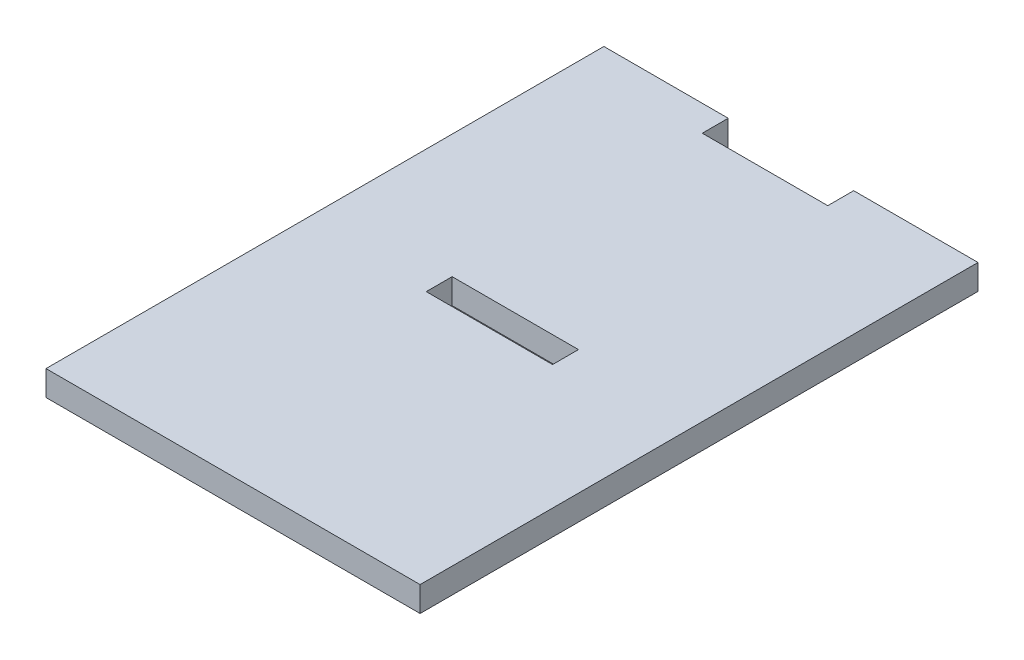
ISO-10303-21;
HEADER;
FILE_DESCRIPTION(('STEP AP214'),'2;1');
FILE_NAME('part.step','',(''),(''),'','','');
FILE_SCHEMA(('AUTOMOTIVE_DESIGN { 1 0 10303 214 1 1 1 1 }'));
ENDSEC;
DATA;
#1=APPLICATION_CONTEXT('core data for automotive mechanical design processes');
#2=APPLICATION_PROTOCOL_DEFINITION('international standard','automotive_design',2000,#1);
#3=PRODUCT_CONTEXT('',#1,'mechanical');
#4=PRODUCT('Part','Part','',(#3));
#5=PRODUCT_RELATED_PRODUCT_CATEGORY('part','',(#4));
#6=PRODUCT_DEFINITION_FORMATION('','',#4);
#7=PRODUCT_DEFINITION_CONTEXT('part definition',#1,'design');
#8=PRODUCT_DEFINITION('design','',#6,#7);
#9=PRODUCT_DEFINITION_SHAPE('','',#8);
#10=(LENGTH_UNIT() NAMED_UNIT(*) SI_UNIT(.MILLI.,.METRE.));
#11=(NAMED_UNIT(*) PLANE_ANGLE_UNIT() SI_UNIT($,.RADIAN.));
#12=(NAMED_UNIT(*) SI_UNIT($,.STERADIAN.) SOLID_ANGLE_UNIT());
#13=UNCERTAINTY_MEASURE_WITH_UNIT(LENGTH_MEASURE(1.E-05),#10,'distance_accuracy_value','');
#14=(GEOMETRIC_REPRESENTATION_CONTEXT(3) GLOBAL_UNCERTAINTY_ASSIGNED_CONTEXT((#13)) GLOBAL_UNIT_ASSIGNED_CONTEXT((#10,
#11,#12)) REPRESENTATION_CONTEXT('',''));
#15=CARTESIAN_POINT('',(0.,0.,0.));
#16=DIRECTION('',(0.,0.,1.));
#17=DIRECTION('',(1.,0.,0.));
#18=AXIS2_PLACEMENT_3D('',#15,#16,#17);
#19=CARTESIAN_POINT('',(0.,3.,0.));
#20=DIRECTION('',(0.,-1.,0.));
#21=DIRECTION('',(0.,0.,-1.));
#22=AXIS2_PLACEMENT_3D('',#19,#20,#21);
#23=PLANE('',#22);
#24=DIRECTION('',(0.,0.,1.));
#25=VECTOR('',#24,1.);
#26=CARTESIAN_POINT('',(0.,3.,0.));
#27=LINE('',#26,#25);
#28=CARTESIAN_POINT('',(0.,3.,-66.69));
#29=VERTEX_POINT('',#28);
#30=CARTESIAN_POINT('',(0.,3.,0.));
#31=VERTEX_POINT('',#30);
#32=EDGE_CURVE('E164',#29,#31,#27,.T.);
#33=ORIENTED_EDGE('',*,*,#32,.T.);
#34=DIRECTION('',(1.,0.,0.));
#35=VECTOR('',#34,1.);
#36=CARTESIAN_POINT('',(0.,3.,0.));
#37=LINE('',#36,#35);
#38=CARTESIAN_POINT('',(44.72,3.,0.));
#39=VERTEX_POINT('',#38);
#40=EDGE_CURVE('E167',#31,#39,#37,.T.);
#41=ORIENTED_EDGE('',*,*,#40,.T.);
#42=DIRECTION('',(0.,0.,-1.));
#43=VECTOR('',#42,1.);
#44=CARTESIAN_POINT('',(44.72,3.,0.));
#45=LINE('',#44,#43);
#46=CARTESIAN_POINT('',(44.72,3.,-66.69));
#47=VERTEX_POINT('',#46);
#48=EDGE_CURVE('E170',#39,#47,#45,.T.);
#49=ORIENTED_EDGE('',*,*,#48,.T.);
#50=DIRECTION('',(-1.,0.,0.));
#51=VECTOR('',#50,1.);
#52=CARTESIAN_POINT('',(29.86,3.,-66.69));
#53=LINE('',#52,#51);
#54=CARTESIAN_POINT('',(29.86,3.,-66.69));
#55=VERTEX_POINT('',#54);
#56=EDGE_CURVE('E172',#47,#55,#53,.T.);
#57=ORIENTED_EDGE('',*,*,#56,.T.);
#58=DIRECTION('',(0.,0.,1.));
#59=VECTOR('',#58,1.);
#60=CARTESIAN_POINT('',(29.86,3.,-66.69));
#61=LINE('',#60,#59);
#62=CARTESIAN_POINT('',(29.86,3.,-63.59));
#63=VERTEX_POINT('',#62);
#64=EDGE_CURVE('E174',#55,#63,#61,.T.);
#65=ORIENTED_EDGE('',*,*,#64,.T.);
#66=DIRECTION('',(-1.,0.,0.));
#67=VECTOR('',#66,1.);
#68=CARTESIAN_POINT('',(14.86,3.,-63.59));
#69=LINE('',#68,#67);
#70=CARTESIAN_POINT('',(14.86,3.,-63.59));
#71=VERTEX_POINT('',#70);
#72=EDGE_CURVE('E176',#63,#71,#69,.T.);
#73=ORIENTED_EDGE('',*,*,#72,.T.);
#74=DIRECTION('',(0.,0.,-1.));
#75=VECTOR('',#74,1.);
#76=CARTESIAN_POINT('',(14.86,3.,-66.69));
#77=LINE('',#76,#75);
#78=CARTESIAN_POINT('',(14.86,3.,-66.69));
#79=VERTEX_POINT('',#78);
#80=EDGE_CURVE('E178',#71,#79,#77,.T.);
#81=ORIENTED_EDGE('',*,*,#80,.T.);
#82=DIRECTION('',(-1.,0.,0.));
#83=VECTOR('',#82,1.);
#84=CARTESIAN_POINT('',(0.,3.,-66.69));
#85=LINE('',#84,#83);
#86=EDGE_CURVE('E180',#79,#29,#85,.T.);
#87=ORIENTED_EDGE('',*,*,#86,.T.);
#88=EDGE_LOOP('',(#33,#41,#49,#57,#65,#73,#81,#87));
#89=FACE_BOUND('',#88,.T.);
#90=DIRECTION('',(0.,0.,1.));
#91=VECTOR('',#90,1.);
#92=CARTESIAN_POINT('',(14.76,3.,-33.79));
#93=LINE('',#92,#91);
#94=CARTESIAN_POINT('',(14.76,3.,-33.79));
#95=VERTEX_POINT('',#94);
#96=CARTESIAN_POINT('',(14.76,3.,-30.69));
#97=VERTEX_POINT('',#96);
#98=EDGE_CURVE('E128',#95,#97,#93,.T.);
#99=ORIENTED_EDGE('',*,*,#98,.F.);
#100=DIRECTION('',(-1.,0.,0.));
#101=VECTOR('',#100,1.);
#102=CARTESIAN_POINT('',(14.76,3.,-33.79));
#103=LINE('',#102,#101);
#104=CARTESIAN_POINT('',(29.86,3.,-33.79));
#105=VERTEX_POINT('',#104);
#106=EDGE_CURVE('E150',#105,#95,#103,.T.);
#107=ORIENTED_EDGE('',*,*,#106,.F.);
#108=DIRECTION('',(0.,0.,-1.));
#109=VECTOR('',#108,1.);
#110=CARTESIAN_POINT('',(29.86,3.,-33.79));
#111=LINE('',#110,#109);
#112=CARTESIAN_POINT('',(29.86,3.,-30.69));
#113=VERTEX_POINT('',#112);
#114=EDGE_CURVE('E148',#113,#105,#111,.T.);
#115=ORIENTED_EDGE('',*,*,#114,.F.);
#116=DIRECTION('',(1.,0.,0.));
#117=VECTOR('',#116,1.);
#118=CARTESIAN_POINT('',(14.76,3.,-30.69));
#119=LINE('',#118,#117);
#120=EDGE_CURVE('E136',#97,#113,#119,.T.);
#121=ORIENTED_EDGE('',*,*,#120,.F.);
#122=EDGE_LOOP('',(#99,#107,#115,#121));
#123=FACE_BOUND('',#122,.T.);
#124=ADVANCED_FACE('F39',(#89,#123),#23,.F.);
#125=CARTESIAN_POINT('',(0.,0.,0.));
#126=DIRECTION('',(0.,-1.,0.));
#127=DIRECTION('',(0.,0.,-1.));
#128=AXIS2_PLACEMENT_3D('',#125,#126,#127);
#129=PLANE('',#128);
#130=DIRECTION('',(0.,0.,1.));
#131=VECTOR('',#130,1.);
#132=CARTESIAN_POINT('',(0.,0.,0.));
#133=LINE('',#132,#131);
#134=CARTESIAN_POINT('',(0.,0.,-66.69));
#135=VERTEX_POINT('',#134);
#136=CARTESIAN_POINT('',(0.,0.,0.));
#137=VERTEX_POINT('',#136);
#138=EDGE_CURVE('E144',#135,#137,#133,.T.);
#139=ORIENTED_EDGE('',*,*,#138,.F.);
#140=DIRECTION('',(-1.,0.,0.));
#141=VECTOR('',#140,1.);
#142=CARTESIAN_POINT('',(0.,0.,-66.69));
#143=LINE('',#142,#141);
#144=CARTESIAN_POINT('',(14.86,0.,-66.69));
#145=VERTEX_POINT('',#144);
#146=EDGE_CURVE('E168',#145,#135,#143,.T.);
#147=ORIENTED_EDGE('',*,*,#146,.F.);
#148=DIRECTION('',(0.,0.,-1.));
#149=VECTOR('',#148,1.);
#150=CARTESIAN_POINT('',(14.86,0.,-66.69));
#151=LINE('',#150,#149);
#152=CARTESIAN_POINT('',(14.86,0.,-63.59));
#153=VERTEX_POINT('',#152);
#154=EDGE_CURVE('E195',#153,#145,#151,.T.);
#155=ORIENTED_EDGE('',*,*,#154,.F.);
#156=DIRECTION('',(-1.,0.,0.));
#157=VECTOR('',#156,1.);
#158=CARTESIAN_POINT('',(14.86,0.,-63.59));
#159=LINE('',#158,#157);
#160=CARTESIAN_POINT('',(29.86,0.,-63.59));
#161=VERTEX_POINT('',#160);
#162=EDGE_CURVE('E193',#161,#153,#159,.T.);
#163=ORIENTED_EDGE('',*,*,#162,.F.);
#164=DIRECTION('',(0.,0.,1.));
#165=VECTOR('',#164,1.);
#166=CARTESIAN_POINT('',(29.86,0.,-66.69));
#167=LINE('',#166,#165);
#168=CARTESIAN_POINT('',(29.86,0.,-66.69));
#169=VERTEX_POINT('',#168);
#170=EDGE_CURVE('E191',#169,#161,#167,.T.);
#171=ORIENTED_EDGE('',*,*,#170,.F.);
#172=DIRECTION('',(-1.,0.,0.));
#173=VECTOR('',#172,1.);
#174=CARTESIAN_POINT('',(29.86,0.,-66.69));
#175=LINE('',#174,#173);
#176=CARTESIAN_POINT('',(44.72,0.,-66.69));
#177=VERTEX_POINT('',#176);
#178=EDGE_CURVE('E189',#177,#169,#175,.T.);
#179=ORIENTED_EDGE('',*,*,#178,.F.);
#180=DIRECTION('',(0.,0.,-1.));
#181=VECTOR('',#180,1.);
#182=CARTESIAN_POINT('',(44.72,0.,0.));
#183=LINE('',#182,#181);
#184=CARTESIAN_POINT('',(44.72,0.,0.));
#185=VERTEX_POINT('',#184);
#186=EDGE_CURVE('E187',#185,#177,#183,.T.);
#187=ORIENTED_EDGE('',*,*,#186,.F.);
#188=DIRECTION('',(1.,0.,0.));
#189=VECTOR('',#188,1.);
#190=CARTESIAN_POINT('',(0.,0.,0.));
#191=LINE('',#190,#189);
#192=EDGE_CURVE('E185',#137,#185,#191,.T.);
#193=ORIENTED_EDGE('',*,*,#192,.F.);
#194=EDGE_LOOP('',(#139,#147,#155,#163,#171,#179,#187,#193));
#195=FACE_BOUND('',#194,.T.);
#196=DIRECTION('',(-1.,0.,0.));
#197=VECTOR('',#196,1.);
#198=CARTESIAN_POINT('',(14.76,0.,-33.79));
#199=LINE('',#198,#197);
#200=CARTESIAN_POINT('',(29.86,0.,-33.79));
#201=VERTEX_POINT('',#200);
#202=CARTESIAN_POINT('',(14.76,0.,-33.79));
#203=VERTEX_POINT('',#202);
#204=EDGE_CURVE('E137',#201,#203,#199,.T.);
#205=ORIENTED_EDGE('',*,*,#204,.T.);
#206=DIRECTION('',(0.,0.,1.));
#207=VECTOR('',#206,1.);
#208=CARTESIAN_POINT('',(14.76,0.,-33.79));
#209=LINE('',#208,#207);
#210=CARTESIAN_POINT('',(14.76,0.,-30.69));
#211=VERTEX_POINT('',#210);
#212=EDGE_CURVE('E62',#203,#211,#209,.T.);
#213=ORIENTED_EDGE('',*,*,#212,.T.);
#214=DIRECTION('',(1.,0.,0.));
#215=VECTOR('',#214,1.);
#216=CARTESIAN_POINT('',(14.76,0.,-30.69));
#217=LINE('',#216,#215);
#218=CARTESIAN_POINT('',(29.86,0.,-30.69));
#219=VERTEX_POINT('',#218);
#220=EDGE_CURVE('E143',#211,#219,#217,.T.);
#221=ORIENTED_EDGE('',*,*,#220,.T.);
#222=DIRECTION('',(0.,0.,-1.));
#223=VECTOR('',#222,1.);
#224=CARTESIAN_POINT('',(29.86,0.,-33.79));
#225=LINE('',#224,#223);
#226=EDGE_CURVE('E156',#219,#201,#225,.T.);
#227=ORIENTED_EDGE('',*,*,#226,.T.);
#228=EDGE_LOOP('',(#205,#213,#221,#227));
#229=FACE_BOUND('',#228,.T.);
#230=ADVANCED_FACE('F225',(#195,#229),#129,.T.);
#231=CARTESIAN_POINT('',(0.,3.,0.));
#232=DIRECTION('',(1.,0.,0.));
#233=DIRECTION('',(0.,0.,-1.));
#234=AXIS2_PLACEMENT_3D('',#231,#232,#233);
#235=PLANE('',#234);
#236=ORIENTED_EDGE('',*,*,#138,.T.);
#237=DIRECTION('',(0.,-1.,0.));
#238=VECTOR('',#237,1.);
#239=CARTESIAN_POINT('',(0.,3.,0.));
#240=LINE('',#239,#238);
#241=EDGE_CURVE('E11',#31,#137,#240,.T.);
#242=ORIENTED_EDGE('',*,*,#241,.F.);
#243=ORIENTED_EDGE('',*,*,#32,.F.);
#244=DIRECTION('',(0.,-1.,0.));
#245=VECTOR('',#244,1.);
#246=CARTESIAN_POINT('',(0.,3.,-66.69));
#247=LINE('',#246,#245);
#248=EDGE_CURVE('E182',#29,#135,#247,.T.);
#249=ORIENTED_EDGE('',*,*,#248,.T.);
#250=EDGE_LOOP('',(#236,#242,#243,#249));
#251=FACE_BOUND('',#250,.T.);
#252=ADVANCED_FACE('F41',(#251),#235,.F.);
#253=CARTESIAN_POINT('',(0.,3.,0.));
#254=DIRECTION('',(0.,0.,-1.));
#255=DIRECTION('',(-1.,0.,0.));
#256=AXIS2_PLACEMENT_3D('',#253,#254,#255);
#257=PLANE('',#256);
#258=ORIENTED_EDGE('',*,*,#192,.T.);
#259=DIRECTION('',(0.,-1.,0.));
#260=VECTOR('',#259,1.);
#261=CARTESIAN_POINT('',(44.72,3.,0.));
#262=LINE('',#261,#260);
#263=EDGE_CURVE('E47',#39,#185,#262,.T.);
#264=ORIENTED_EDGE('',*,*,#263,.F.);
#265=ORIENTED_EDGE('',*,*,#40,.F.);
#266=ORIENTED_EDGE('',*,*,#241,.T.);
#267=EDGE_LOOP('',(#258,#264,#265,#266));
#268=FACE_BOUND('',#267,.T.);
#269=ADVANCED_FACE('F242',(#268),#257,.F.);
#270=CARTESIAN_POINT('',(44.72,3.,0.));
#271=DIRECTION('',(-1.,0.,0.));
#272=DIRECTION('',(0.,0.,1.));
#273=AXIS2_PLACEMENT_3D('',#270,#271,#272);
#274=PLANE('',#273);
#275=ORIENTED_EDGE('',*,*,#186,.T.);
#276=DIRECTION('',(0.,-1.,0.));
#277=VECTOR('',#276,1.);
#278=CARTESIAN_POINT('',(44.72,3.,-66.69));
#279=LINE('',#278,#277);
#280=EDGE_CURVE('E212',#47,#177,#279,.T.);
#281=ORIENTED_EDGE('',*,*,#280,.F.);
#282=ORIENTED_EDGE('',*,*,#48,.F.);
#283=ORIENTED_EDGE('',*,*,#263,.T.);
#284=EDGE_LOOP('',(#275,#281,#282,#283));
#285=FACE_BOUND('',#284,.T.);
#286=ADVANCED_FACE('F219',(#285),#274,.F.);
#287=CARTESIAN_POINT('',(29.86,3.,-66.69));
#288=DIRECTION('',(0.,0.,1.));
#289=DIRECTION('',(1.,0.,0.));
#290=AXIS2_PLACEMENT_3D('',#287,#288,#289);
#291=PLANE('',#290);
#292=ORIENTED_EDGE('',*,*,#178,.T.);
#293=DIRECTION('',(0.,-1.,0.));
#294=VECTOR('',#293,1.);
#295=CARTESIAN_POINT('',(29.86,3.,-66.69));
#296=LINE('',#295,#294);
#297=EDGE_CURVE('E209',#55,#169,#296,.T.);
#298=ORIENTED_EDGE('',*,*,#297,.F.);
#299=ORIENTED_EDGE('',*,*,#56,.F.);
#300=ORIENTED_EDGE('',*,*,#280,.T.);
#301=EDGE_LOOP('',(#292,#298,#299,#300));
#302=FACE_BOUND('',#301,.T.);
#303=ADVANCED_FACE('F231',(#302),#291,.F.);
#304=CARTESIAN_POINT('',(29.86,3.,-66.69));
#305=DIRECTION('',(1.,0.,0.));
#306=DIRECTION('',(0.,0.,-1.));
#307=AXIS2_PLACEMENT_3D('',#304,#305,#306);
#308=PLANE('',#307);
#309=ORIENTED_EDGE('',*,*,#170,.T.);
#310=DIRECTION('',(0.,-1.,0.));
#311=VECTOR('',#310,1.);
#312=CARTESIAN_POINT('',(29.86,3.,-63.59));
#313=LINE('',#312,#311);
#314=EDGE_CURVE('E206',#63,#161,#313,.T.);
#315=ORIENTED_EDGE('',*,*,#314,.F.);
#316=ORIENTED_EDGE('',*,*,#64,.F.);
#317=ORIENTED_EDGE('',*,*,#297,.T.);
#318=EDGE_LOOP('',(#309,#315,#316,#317));
#319=FACE_BOUND('',#318,.T.);
#320=ADVANCED_FACE('F235',(#319),#308,.F.);
#321=CARTESIAN_POINT('',(14.86,3.,-63.59));
#322=DIRECTION('',(0.,0.,1.));
#323=DIRECTION('',(1.,0.,0.));
#324=AXIS2_PLACEMENT_3D('',#321,#322,#323);
#325=PLANE('',#324);
#326=ORIENTED_EDGE('',*,*,#162,.T.);
#327=DIRECTION('',(0.,-1.,0.));
#328=VECTOR('',#327,1.);
#329=CARTESIAN_POINT('',(14.86,3.,-63.59));
#330=LINE('',#329,#328);
#331=EDGE_CURVE('E203',#71,#153,#330,.T.);
#332=ORIENTED_EDGE('',*,*,#331,.F.);
#333=ORIENTED_EDGE('',*,*,#72,.F.);
#334=ORIENTED_EDGE('',*,*,#314,.T.);
#335=EDGE_LOOP('',(#326,#332,#333,#334));
#336=FACE_BOUND('',#335,.T.);
#337=ADVANCED_FACE('F255',(#336),#325,.F.);
#338=CARTESIAN_POINT('',(14.86,3.,-66.69));
#339=DIRECTION('',(-1.,0.,0.));
#340=DIRECTION('',(0.,0.,1.));
#341=AXIS2_PLACEMENT_3D('',#338,#339,#340);
#342=PLANE('',#341);
#343=ORIENTED_EDGE('',*,*,#154,.T.);
#344=DIRECTION('',(0.,-1.,0.));
#345=VECTOR('',#344,1.);
#346=CARTESIAN_POINT('',(14.86,3.,-66.69));
#347=LINE('',#346,#345);
#348=EDGE_CURVE('E200',#79,#145,#347,.T.);
#349=ORIENTED_EDGE('',*,*,#348,.F.);
#350=ORIENTED_EDGE('',*,*,#80,.F.);
#351=ORIENTED_EDGE('',*,*,#331,.T.);
#352=EDGE_LOOP('',(#343,#349,#350,#351));
#353=FACE_BOUND('',#352,.T.);
#354=ADVANCED_FACE('F253',(#353),#342,.F.);
#355=CARTESIAN_POINT('',(0.,3.,-66.69));
#356=DIRECTION('',(0.,0.,1.));
#357=DIRECTION('',(1.,0.,0.));
#358=AXIS2_PLACEMENT_3D('',#355,#356,#357);
#359=PLANE('',#358);
#360=ORIENTED_EDGE('',*,*,#146,.T.);
#361=ORIENTED_EDGE('',*,*,#248,.F.);
#362=ORIENTED_EDGE('',*,*,#86,.F.);
#363=ORIENTED_EDGE('',*,*,#348,.T.);
#364=EDGE_LOOP('',(#360,#361,#362,#363));
#365=FACE_BOUND('',#364,.T.);
#366=ADVANCED_FACE('F248',(#365),#359,.F.);
#367=CARTESIAN_POINT('',(14.76,3.,-33.79));
#368=DIRECTION('',(1.,0.,0.));
#369=DIRECTION('',(0.,0.,-1.));
#370=AXIS2_PLACEMENT_3D('',#367,#368,#369);
#371=PLANE('',#370);
#372=ORIENTED_EDGE('',*,*,#212,.F.);
#373=DIRECTION('',(0.,-1.,0.));
#374=VECTOR('',#373,1.);
#375=CARTESIAN_POINT('',(14.76,3.,-33.79));
#376=LINE('',#375,#374);
#377=EDGE_CURVE('E132',#95,#203,#376,.T.);
#378=ORIENTED_EDGE('',*,*,#377,.F.);
#379=ORIENTED_EDGE('',*,*,#98,.T.);
#380=DIRECTION('',(0.,-1.,0.));
#381=VECTOR('',#380,1.);
#382=CARTESIAN_POINT('',(14.76,3.,-30.69));
#383=LINE('',#382,#381);
#384=EDGE_CURVE('E131',#97,#211,#383,.T.);
#385=ORIENTED_EDGE('',*,*,#384,.T.);
#386=EDGE_LOOP('',(#372,#378,#379,#385));
#387=FACE_BOUND('',#386,.T.);
#388=ADVANCED_FACE('F130',(#387),#371,.T.);
#389=CARTESIAN_POINT('',(14.76,3.,-30.69));
#390=DIRECTION('',(0.,0.,-1.));
#391=DIRECTION('',(-1.,0.,0.));
#392=AXIS2_PLACEMENT_3D('',#389,#390,#391);
#393=PLANE('',#392);
#394=ORIENTED_EDGE('',*,*,#220,.F.);
#395=ORIENTED_EDGE('',*,*,#384,.F.);
#396=ORIENTED_EDGE('',*,*,#120,.T.);
#397=DIRECTION('',(0.,-1.,0.));
#398=VECTOR('',#397,1.);
#399=CARTESIAN_POINT('',(29.86,3.,-30.69));
#400=LINE('',#399,#398);
#401=EDGE_CURVE('E145',#113,#219,#400,.T.);
#402=ORIENTED_EDGE('',*,*,#401,.T.);
#403=EDGE_LOOP('',(#394,#395,#396,#402));
#404=FACE_BOUND('',#403,.T.);
#405=ADVANCED_FACE('F140',(#404),#393,.T.);
#406=CARTESIAN_POINT('',(29.86,3.,-33.79));
#407=DIRECTION('',(-1.,0.,0.));
#408=DIRECTION('',(0.,0.,1.));
#409=AXIS2_PLACEMENT_3D('',#406,#407,#408);
#410=PLANE('',#409);
#411=ORIENTED_EDGE('',*,*,#226,.F.);
#412=ORIENTED_EDGE('',*,*,#401,.F.);
#413=ORIENTED_EDGE('',*,*,#114,.T.);
#414=DIRECTION('',(0.,-1.,0.));
#415=VECTOR('',#414,1.);
#416=CARTESIAN_POINT('',(29.86,3.,-33.79));
#417=LINE('',#416,#415);
#418=EDGE_CURVE('E54',#105,#201,#417,.T.);
#419=ORIENTED_EDGE('',*,*,#418,.T.);
#420=EDGE_LOOP('',(#411,#412,#413,#419));
#421=FACE_BOUND('',#420,.T.);
#422=ADVANCED_FACE('F280',(#421),#410,.T.);
#423=CARTESIAN_POINT('',(14.76,3.,-33.79));
#424=DIRECTION('',(0.,0.,1.));
#425=DIRECTION('',(1.,0.,0.));
#426=AXIS2_PLACEMENT_3D('',#423,#424,#425);
#427=PLANE('',#426);
#428=ORIENTED_EDGE('',*,*,#204,.F.);
#429=ORIENTED_EDGE('',*,*,#418,.F.);
#430=ORIENTED_EDGE('',*,*,#106,.T.);
#431=ORIENTED_EDGE('',*,*,#377,.T.);
#432=EDGE_LOOP('',(#428,#429,#430,#431));
#433=FACE_BOUND('',#432,.T.);
#434=ADVANCED_FACE('F284',(#433),#427,.T.);
#435=CLOSED_SHELL('',(#124,#230,#252,#269,#286,#303,#320,#337,#354,#366,#388,#405,#422,#434));
#436=MANIFOLD_SOLID_BREP('B2',#435);
#437=ADVANCED_BREP_SHAPE_REPRESENTATION('',(#18,#436),#14);
#438=SHAPE_DEFINITION_REPRESENTATION(#9,#437);
ENDSEC;
END-ISO-10303-21;
